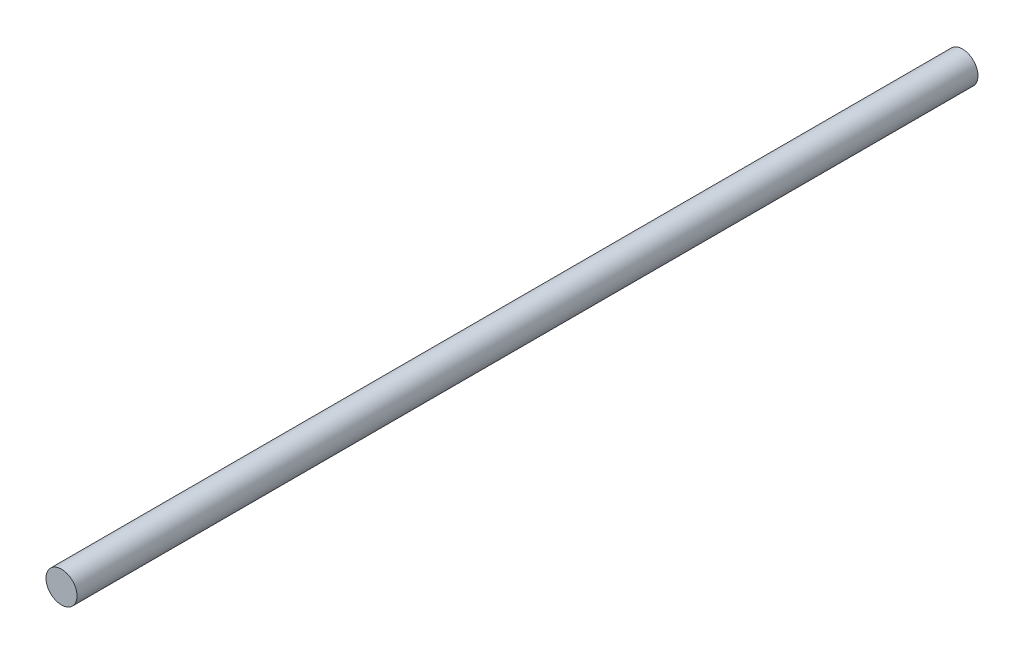
ISO-10303-21;
HEADER;
FILE_DESCRIPTION(('STEP AP214'),'2;1');
FILE_NAME('part.step','',(''),(''),'','','');
FILE_SCHEMA(('AUTOMOTIVE_DESIGN { 1 0 10303 214 1 1 1 1 }'));
ENDSEC;
DATA;
#1=APPLICATION_CONTEXT('core data for automotive mechanical design processes');
#2=APPLICATION_PROTOCOL_DEFINITION('international standard','automotive_design',2000,#1);
#3=PRODUCT_CONTEXT('',#1,'mechanical');
#4=PRODUCT('Part','Part','',(#3));
#5=PRODUCT_RELATED_PRODUCT_CATEGORY('part','',(#4));
#6=PRODUCT_DEFINITION_FORMATION('','',#4);
#7=PRODUCT_DEFINITION_CONTEXT('part definition',#1,'design');
#8=PRODUCT_DEFINITION('design','',#6,#7);
#9=PRODUCT_DEFINITION_SHAPE('','',#8);
#10=(LENGTH_UNIT() NAMED_UNIT(*) SI_UNIT(.MILLI.,.METRE.));
#11=(NAMED_UNIT(*) PLANE_ANGLE_UNIT() SI_UNIT($,.RADIAN.));
#12=(NAMED_UNIT(*) SI_UNIT($,.STERADIAN.) SOLID_ANGLE_UNIT());
#13=UNCERTAINTY_MEASURE_WITH_UNIT(LENGTH_MEASURE(1.E-05),#10,'distance_accuracy_value','');
#14=(GEOMETRIC_REPRESENTATION_CONTEXT(3) GLOBAL_UNCERTAINTY_ASSIGNED_CONTEXT((#13)) GLOBAL_UNIT_ASSIGNED_CONTEXT((#10,
#11,#12)) REPRESENTATION_CONTEXT('',''));
#15=CARTESIAN_POINT('',(0.,0.,0.));
#16=DIRECTION('',(0.,0.,1.));
#17=DIRECTION('',(1.,0.,0.));
#18=AXIS2_PLACEMENT_3D('',#15,#16,#17);
#19=CARTESIAN_POINT('',(0.,0.,290.));
#20=DIRECTION('',(0.,0.,-1.));
#21=DIRECTION('',(-1.,0.,0.));
#22=AXIS2_PLACEMENT_3D('',#19,#20,#21);
#23=CYLINDRICAL_SURFACE('',#22,5.);
#24=CARTESIAN_POINT('',(0.,0.,290.));
#25=DIRECTION('',(0.,0.,1.));
#26=DIRECTION('',(1.,0.,0.));
#27=AXIS2_PLACEMENT_3D('',#24,#25,#26);
#28=CIRCLE('',#27,5.);
#29=CARTESIAN_POINT('',(5.,0.,290.));
#30=VERTEX_POINT('',#29);
#31=EDGE_CURVE('E10',#30,#30,#28,.T.);
#32=ORIENTED_EDGE('',*,*,#31,.F.);
#33=EDGE_LOOP('',(#32));
#34=FACE_BOUND('',#33,.T.);
#35=CARTESIAN_POINT('',(0.,0.,0.));
#36=DIRECTION('',(0.,0.,1.));
#37=DIRECTION('',(1.,0.,0.));
#38=AXIS2_PLACEMENT_3D('',#35,#36,#37);
#39=CIRCLE('',#38,5.);
#40=CARTESIAN_POINT('',(5.,0.,0.));
#41=VERTEX_POINT('',#40);
#42=EDGE_CURVE('E38',#41,#41,#39,.T.);
#43=ORIENTED_EDGE('',*,*,#42,.T.);
#44=EDGE_LOOP('',(#43));
#45=FACE_BOUND('',#44,.T.);
#46=ADVANCED_FACE('F35',(#34,#45),#23,.T.);
#47=CARTESIAN_POINT('',(0.,0.,290.));
#48=DIRECTION('',(0.,0.,1.));
#49=DIRECTION('',(1.,0.,0.));
#50=AXIS2_PLACEMENT_3D('',#47,#48,#49);
#51=PLANE('',#50);
#52=ORIENTED_EDGE('',*,*,#31,.T.);
#53=EDGE_LOOP('',(#52));
#54=FACE_BOUND('',#53,.T.);
#55=ADVANCED_FACE('F50',(#54),#51,.T.);
#56=CARTESIAN_POINT('',(0.,0.,0.));
#57=DIRECTION('',(0.,0.,1.));
#58=DIRECTION('',(1.,0.,0.));
#59=AXIS2_PLACEMENT_3D('',#56,#57,#58);
#60=PLANE('',#59);
#61=ORIENTED_EDGE('',*,*,#42,.F.);
#62=EDGE_LOOP('',(#61));
#63=FACE_BOUND('',#62,.T.);
#64=ADVANCED_FACE('F48',(#63),#60,.F.);
#65=CLOSED_SHELL('',(#46,#55,#64));
#66=MANIFOLD_SOLID_BREP('B2',#65);
#67=ADVANCED_BREP_SHAPE_REPRESENTATION('',(#18,#66),#14);
#68=SHAPE_DEFINITION_REPRESENTATION(#9,#67);
ENDSEC;
END-ISO-10303-21;
